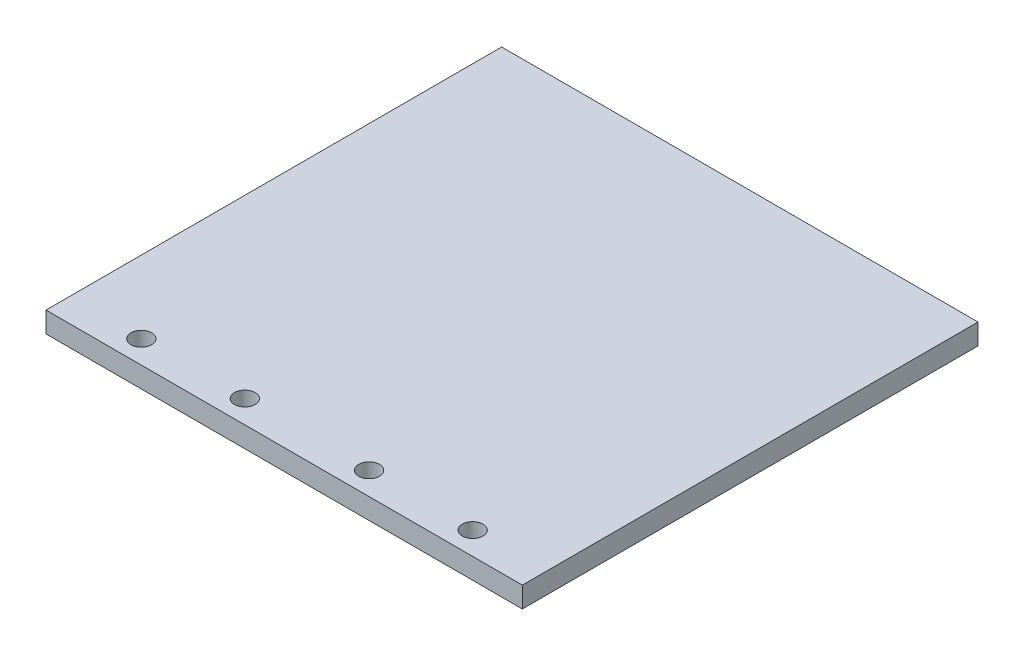
ISO-10303-21;
HEADER;
FILE_DESCRIPTION(('STEP AP214'),'2;1');
FILE_NAME('part.step','',(''),(''),'','','');
FILE_SCHEMA(('AUTOMOTIVE_DESIGN { 1 0 10303 214 1 1 1 1 }'));
ENDSEC;
DATA;
#1=APPLICATION_CONTEXT('core data for automotive mechanical design processes');
#2=APPLICATION_PROTOCOL_DEFINITION('international standard','automotive_design',2000,#1);
#3=PRODUCT_CONTEXT('',#1,'mechanical');
#4=PRODUCT('Part','Part','',(#3));
#5=PRODUCT_RELATED_PRODUCT_CATEGORY('part','',(#4));
#6=PRODUCT_DEFINITION_FORMATION('','',#4);
#7=PRODUCT_DEFINITION_CONTEXT('part definition',#1,'design');
#8=PRODUCT_DEFINITION('design','',#6,#7);
#9=PRODUCT_DEFINITION_SHAPE('','',#8);
#10=(LENGTH_UNIT() NAMED_UNIT(*) SI_UNIT(.MILLI.,.METRE.));
#11=(NAMED_UNIT(*) PLANE_ANGLE_UNIT() SI_UNIT($,.RADIAN.));
#12=(NAMED_UNIT(*) SI_UNIT($,.STERADIAN.) SOLID_ANGLE_UNIT());
#13=UNCERTAINTY_MEASURE_WITH_UNIT(LENGTH_MEASURE(1.E-05),#10,'distance_accuracy_value','');
#14=(GEOMETRIC_REPRESENTATION_CONTEXT(3) GLOBAL_UNCERTAINTY_ASSIGNED_CONTEXT((#13)) GLOBAL_UNIT_ASSIGNED_CONTEXT((#10,
#11,#12)) REPRESENTATION_CONTEXT('',''));
#15=CARTESIAN_POINT('',(0.,0.,0.));
#16=DIRECTION('',(0.,0.,1.));
#17=DIRECTION('',(1.,0.,0.));
#18=AXIS2_PLACEMENT_3D('',#15,#16,#17);
#19=CARTESIAN_POINT('',(-57.5,5.,-55.));
#20=DIRECTION('',(1.,0.,0.));
#21=DIRECTION('',(0.,0.,-1.));
#22=AXIS2_PLACEMENT_3D('',#19,#20,#21);
#23=PLANE('',#22);
#24=DIRECTION('',(0.,0.,1.));
#25=VECTOR('',#24,1.);
#26=CARTESIAN_POINT('',(-57.5,0.,-55.));
#27=LINE('',#26,#25);
#28=CARTESIAN_POINT('',(-57.5,0.,-55.));
#29=VERTEX_POINT('',#28);
#30=CARTESIAN_POINT('',(-57.5,0.,55.));
#31=VERTEX_POINT('',#30);
#32=EDGE_CURVE('E109',#29,#31,#27,.T.);
#33=ORIENTED_EDGE('',*,*,#32,.T.);
#34=DIRECTION('',(0.,-1.,0.));
#35=VECTOR('',#34,1.);
#36=CARTESIAN_POINT('',(-57.5,5.,55.));
#37=LINE('',#36,#35);
#38=CARTESIAN_POINT('',(-57.5,5.,55.));
#39=VERTEX_POINT('',#38);
#40=EDGE_CURVE('E11',#39,#31,#37,.T.);
#41=ORIENTED_EDGE('',*,*,#40,.F.);
#42=DIRECTION('',(0.,0.,1.));
#43=VECTOR('',#42,1.);
#44=CARTESIAN_POINT('',(-57.5,5.,-55.));
#45=LINE('',#44,#43);
#46=CARTESIAN_POINT('',(-57.5,5.,-55.));
#47=VERTEX_POINT('',#46);
#48=EDGE_CURVE('E93',#47,#39,#45,.T.);
#49=ORIENTED_EDGE('',*,*,#48,.F.);
#50=DIRECTION('',(0.,-1.,0.));
#51=VECTOR('',#50,1.);
#52=CARTESIAN_POINT('',(-57.5,5.,-55.));
#53=LINE('',#52,#51);
#54=EDGE_CURVE('E105',#47,#29,#53,.T.);
#55=ORIENTED_EDGE('',*,*,#54,.T.);
#56=EDGE_LOOP('',(#33,#41,#49,#55));
#57=FACE_BOUND('',#56,.T.);
#58=ADVANCED_FACE('F41',(#57),#23,.F.);
#59=CARTESIAN_POINT('',(-57.5,5.,55.));
#60=DIRECTION('',(0.,0.,-1.));
#61=DIRECTION('',(-1.,0.,0.));
#62=AXIS2_PLACEMENT_3D('',#59,#60,#61);
#63=PLANE('',#62);
#64=DIRECTION('',(1.,0.,0.));
#65=VECTOR('',#64,1.);
#66=CARTESIAN_POINT('',(-57.5,0.,55.));
#67=LINE('',#66,#65);
#68=CARTESIAN_POINT('',(57.5,0.,55.));
#69=VERTEX_POINT('',#68);
#70=EDGE_CURVE('E98',#31,#69,#67,.T.);
#71=ORIENTED_EDGE('',*,*,#70,.T.);
#72=DIRECTION('',(0.,-1.,0.));
#73=VECTOR('',#72,1.);
#74=CARTESIAN_POINT('',(57.5,5.,55.));
#75=LINE('',#74,#73);
#76=CARTESIAN_POINT('',(57.5,5.,55.));
#77=VERTEX_POINT('',#76);
#78=EDGE_CURVE('E50',#77,#69,#75,.T.);
#79=ORIENTED_EDGE('',*,*,#78,.F.);
#80=DIRECTION('',(1.,0.,0.));
#81=VECTOR('',#80,1.);
#82=CARTESIAN_POINT('',(-57.5,5.,55.));
#83=LINE('',#82,#81);
#84=EDGE_CURVE('E88',#39,#77,#83,.T.);
#85=ORIENTED_EDGE('',*,*,#84,.F.);
#86=ORIENTED_EDGE('',*,*,#40,.T.);
#87=EDGE_LOOP('',(#71,#79,#85,#86));
#88=FACE_BOUND('',#87,.T.);
#89=ADVANCED_FACE('F97',(#88),#63,.F.);
#90=CARTESIAN_POINT('',(57.5,5.,-55.));
#91=DIRECTION('',(-1.,0.,0.));
#92=DIRECTION('',(0.,0.,1.));
#93=AXIS2_PLACEMENT_3D('',#90,#91,#92);
#94=PLANE('',#93);
#95=DIRECTION('',(0.,0.,-1.));
#96=VECTOR('',#95,1.);
#97=CARTESIAN_POINT('',(57.5,0.,-55.));
#98=LINE('',#97,#96);
#99=CARTESIAN_POINT('',(57.5,0.,-55.));
#100=VERTEX_POINT('',#99);
#101=EDGE_CURVE('E75',#69,#100,#98,.T.);
#102=ORIENTED_EDGE('',*,*,#101,.T.);
#103=DIRECTION('',(0.,-1.,0.));
#104=VECTOR('',#103,1.);
#105=CARTESIAN_POINT('',(57.5,5.,-55.));
#106=LINE('',#105,#104);
#107=CARTESIAN_POINT('',(57.5,5.,-55.));
#108=VERTEX_POINT('',#107);
#109=EDGE_CURVE('E100',#108,#100,#106,.T.);
#110=ORIENTED_EDGE('',*,*,#109,.F.);
#111=DIRECTION('',(0.,0.,-1.));
#112=VECTOR('',#111,1.);
#113=CARTESIAN_POINT('',(57.5,5.,-55.));
#114=LINE('',#113,#112);
#115=EDGE_CURVE('E91',#77,#108,#114,.T.);
#116=ORIENTED_EDGE('',*,*,#115,.F.);
#117=ORIENTED_EDGE('',*,*,#78,.T.);
#118=EDGE_LOOP('',(#102,#110,#116,#117));
#119=FACE_BOUND('',#118,.T.);
#120=ADVANCED_FACE('F101',(#119),#94,.F.);
#121=CARTESIAN_POINT('',(-57.5,5.,-55.));
#122=DIRECTION('',(0.,0.,1.));
#123=DIRECTION('',(1.,0.,0.));
#124=AXIS2_PLACEMENT_3D('',#121,#122,#123);
#125=PLANE('',#124);
#126=DIRECTION('',(-1.,0.,0.));
#127=VECTOR('',#126,1.);
#128=CARTESIAN_POINT('',(-57.5,0.,-55.));
#129=LINE('',#128,#127);
#130=EDGE_CURVE('E81',#100,#29,#129,.T.);
#131=ORIENTED_EDGE('',*,*,#130,.T.);
#132=ORIENTED_EDGE('',*,*,#54,.F.);
#133=DIRECTION('',(-1.,0.,0.));
#134=VECTOR('',#133,1.);
#135=CARTESIAN_POINT('',(-57.5,5.,-55.));
#136=LINE('',#135,#134);
#137=EDGE_CURVE('E58',#108,#47,#136,.T.);
#138=ORIENTED_EDGE('',*,*,#137,.F.);
#139=ORIENTED_EDGE('',*,*,#109,.T.);
#140=EDGE_LOOP('',(#131,#132,#138,#139));
#141=FACE_BOUND('',#140,.T.);
#142=ADVANCED_FACE('F123',(#141),#125,.F.);
#143=CARTESIAN_POINT('',(0.,5.,0.));
#144=DIRECTION('',(0.,1.,0.));
#145=DIRECTION('',(0.,0.,1.));
#146=AXIS2_PLACEMENT_3D('',#143,#144,#145);
#147=PLANE('',#146);
#148=CARTESIAN_POINT('',(-40.,5.,49.5));
#149=DIRECTION('',(0.,1.,0.));
#150=DIRECTION('',(0.,0.,1.));
#151=AXIS2_PLACEMENT_3D('',#148,#149,#150);
#152=CIRCLE('',#151,2.5);
#153=CARTESIAN_POINT('',(-40.,5.,52.));
#154=VERTEX_POINT('',#153);
#155=EDGE_CURVE('E147',#154,#154,#152,.F.);
#156=ORIENTED_EDGE('',*,*,#155,.T.);
#157=EDGE_LOOP('',(#156));
#158=FACE_BOUND('',#157,.T.);
#159=CARTESIAN_POINT('',(15.,5.,49.5));
#160=DIRECTION('',(0.,1.,0.));
#161=DIRECTION('',(0.,0.,1.));
#162=AXIS2_PLACEMENT_3D('',#159,#160,#161);
#163=CIRCLE('',#162,2.5);
#164=CARTESIAN_POINT('',(15.,5.,52.));
#165=VERTEX_POINT('',#164);
#166=EDGE_CURVE('E148',#165,#165,#163,.F.);
#167=ORIENTED_EDGE('',*,*,#166,.T.);
#168=EDGE_LOOP('',(#167));
#169=FACE_BOUND('',#168,.T.);
#170=CARTESIAN_POINT('',(40.,5.,49.5));
#171=DIRECTION('',(0.,1.,0.));
#172=DIRECTION('',(0.,0.,1.));
#173=AXIS2_PLACEMENT_3D('',#170,#171,#172);
#174=CIRCLE('',#173,2.5);
#175=CARTESIAN_POINT('',(40.,5.,52.));
#176=VERTEX_POINT('',#175);
#177=EDGE_CURVE('E130',#176,#176,#174,.F.);
#178=ORIENTED_EDGE('',*,*,#177,.T.);
#179=EDGE_LOOP('',(#178));
#180=FACE_BOUND('',#179,.T.);
#181=CARTESIAN_POINT('',(-15.,5.,49.5));
#182=DIRECTION('',(0.,1.,0.));
#183=DIRECTION('',(0.,0.,1.));
#184=AXIS2_PLACEMENT_3D('',#181,#182,#183);
#185=CIRCLE('',#184,2.5);
#186=CARTESIAN_POINT('',(-15.,5.,52.));
#187=VERTEX_POINT('',#186);
#188=EDGE_CURVE('E139',#187,#187,#185,.F.);
#189=ORIENTED_EDGE('',*,*,#188,.T.);
#190=EDGE_LOOP('',(#189));
#191=FACE_BOUND('',#190,.T.);
#192=ORIENTED_EDGE('',*,*,#48,.T.);
#193=ORIENTED_EDGE('',*,*,#84,.T.);
#194=ORIENTED_EDGE('',*,*,#115,.T.);
#195=ORIENTED_EDGE('',*,*,#137,.T.);
#196=EDGE_LOOP('',(#192,#193,#194,#195));
#197=FACE_BOUND('',#196,.T.);
#198=ADVANCED_FACE('F89',(#158,#169,#180,#191,#197),#147,.T.);
#199=CARTESIAN_POINT('',(0.,0.,0.));
#200=DIRECTION('',(0.,1.,0.));
#201=DIRECTION('',(0.,0.,1.));
#202=AXIS2_PLACEMENT_3D('',#199,#200,#201);
#203=PLANE('',#202);
#204=CARTESIAN_POINT('',(-40.,0.,49.5));
#205=DIRECTION('',(0.,-1.,0.));
#206=DIRECTION('',(0.,0.,-1.));
#207=AXIS2_PLACEMENT_3D('',#204,#205,#206);
#208=CIRCLE('',#207,2.5);
#209=CARTESIAN_POINT('',(-40.,0.,47.));
#210=VERTEX_POINT('',#209);
#211=EDGE_CURVE('E113',#210,#210,#208,.T.);
#212=ORIENTED_EDGE('',*,*,#211,.F.);
#213=EDGE_LOOP('',(#212));
#214=FACE_BOUND('',#213,.T.);
#215=CARTESIAN_POINT('',(15.,0.,49.5));
#216=DIRECTION('',(0.,-1.,0.));
#217=DIRECTION('',(0.,0.,1.));
#218=AXIS2_PLACEMENT_3D('',#215,#216,#217);
#219=CIRCLE('',#218,2.5);
#220=CARTESIAN_POINT('',(15.,0.,52.));
#221=VERTEX_POINT('',#220);
#222=EDGE_CURVE('E135',#221,#221,#219,.T.);
#223=ORIENTED_EDGE('',*,*,#222,.F.);
#224=EDGE_LOOP('',(#223));
#225=FACE_BOUND('',#224,.T.);
#226=CARTESIAN_POINT('',(40.,0.,49.5));
#227=DIRECTION('',(0.,-1.,0.));
#228=DIRECTION('',(0.,0.,1.));
#229=AXIS2_PLACEMENT_3D('',#226,#227,#228);
#230=CIRCLE('',#229,2.5);
#231=CARTESIAN_POINT('',(40.,0.,52.));
#232=VERTEX_POINT('',#231);
#233=EDGE_CURVE('E134',#232,#232,#230,.T.);
#234=ORIENTED_EDGE('',*,*,#233,.F.);
#235=EDGE_LOOP('',(#234));
#236=FACE_BOUND('',#235,.T.);
#237=CARTESIAN_POINT('',(-15.,0.,49.5));
#238=DIRECTION('',(0.,-1.,0.));
#239=DIRECTION('',(0.,0.,-1.));
#240=AXIS2_PLACEMENT_3D('',#237,#238,#239);
#241=CIRCLE('',#240,2.5);
#242=CARTESIAN_POINT('',(-15.,0.,47.));
#243=VERTEX_POINT('',#242);
#244=EDGE_CURVE('E143',#243,#243,#241,.T.);
#245=ORIENTED_EDGE('',*,*,#244,.F.);
#246=EDGE_LOOP('',(#245));
#247=FACE_BOUND('',#246,.T.);
#248=ORIENTED_EDGE('',*,*,#32,.F.);
#249=ORIENTED_EDGE('',*,*,#130,.F.);
#250=ORIENTED_EDGE('',*,*,#101,.F.);
#251=ORIENTED_EDGE('',*,*,#70,.F.);
#252=EDGE_LOOP('',(#248,#249,#250,#251));
#253=FACE_BOUND('',#252,.T.);
#254=ADVANCED_FACE('F126',(#214,#225,#236,#247,#253),#203,.F.);
#255=CARTESIAN_POINT('',(-15.,5.001,49.5));
#256=DIRECTION('',(0.,-1.,0.));
#257=DIRECTION('',(0.,0.,-1.));
#258=AXIS2_PLACEMENT_3D('',#255,#256,#257);
#259=CYLINDRICAL_SURFACE('',#258,2.5);
#260=ORIENTED_EDGE('',*,*,#188,.F.);
#261=EDGE_LOOP('',(#260));
#262=FACE_BOUND('',#261,.T.);
#263=ORIENTED_EDGE('',*,*,#244,.T.);
#264=EDGE_LOOP('',(#263));
#265=FACE_BOUND('',#264,.T.);
#266=ADVANCED_FACE('F166',(#262,#265),#259,.F.);
#267=CARTESIAN_POINT('',(40.,5.001,49.5));
#268=DIRECTION('',(0.,-1.,0.));
#269=DIRECTION('',(0.,0.,-1.));
#270=AXIS2_PLACEMENT_3D('',#267,#268,#269);
#271=CYLINDRICAL_SURFACE('',#270,2.5);
#272=ORIENTED_EDGE('',*,*,#177,.F.);
#273=EDGE_LOOP('',(#272));
#274=FACE_BOUND('',#273,.T.);
#275=ORIENTED_EDGE('',*,*,#233,.T.);
#276=EDGE_LOOP('',(#275));
#277=FACE_BOUND('',#276,.T.);
#278=ADVANCED_FACE('F175',(#274,#277),#271,.F.);
#279=CARTESIAN_POINT('',(15.,5.001,49.5));
#280=DIRECTION('',(0.,-1.,0.));
#281=DIRECTION('',(0.,0.,-1.));
#282=AXIS2_PLACEMENT_3D('',#279,#280,#281);
#283=CYLINDRICAL_SURFACE('',#282,2.5);
#284=ORIENTED_EDGE('',*,*,#166,.F.);
#285=EDGE_LOOP('',(#284));
#286=FACE_BOUND('',#285,.T.);
#287=ORIENTED_EDGE('',*,*,#222,.T.);
#288=EDGE_LOOP('',(#287));
#289=FACE_BOUND('',#288,.T.);
#290=ADVANCED_FACE('F181',(#286,#289),#283,.F.);
#291=CARTESIAN_POINT('',(-40.,5.001,49.5));
#292=DIRECTION('',(0.,-1.,0.));
#293=DIRECTION('',(0.,0.,-1.));
#294=AXIS2_PLACEMENT_3D('',#291,#292,#293);
#295=CYLINDRICAL_SURFACE('',#294,2.5);
#296=ORIENTED_EDGE('',*,*,#155,.F.);
#297=EDGE_LOOP('',(#296));
#298=FACE_BOUND('',#297,.T.);
#299=ORIENTED_EDGE('',*,*,#211,.T.);
#300=EDGE_LOOP('',(#299));
#301=FACE_BOUND('',#300,.T.);
#302=ADVANCED_FACE('F162',(#298,#301),#295,.F.);
#303=CLOSED_SHELL('',(#58,#89,#120,#142,#198,#254,#266,#278,#290,#302));
#304=MANIFOLD_SOLID_BREP('B2',#303);
#305=ADVANCED_BREP_SHAPE_REPRESENTATION('',(#18,#304),#14);
#306=SHAPE_DEFINITION_REPRESENTATION(#9,#305);
ENDSEC;
END-ISO-10303-21;
